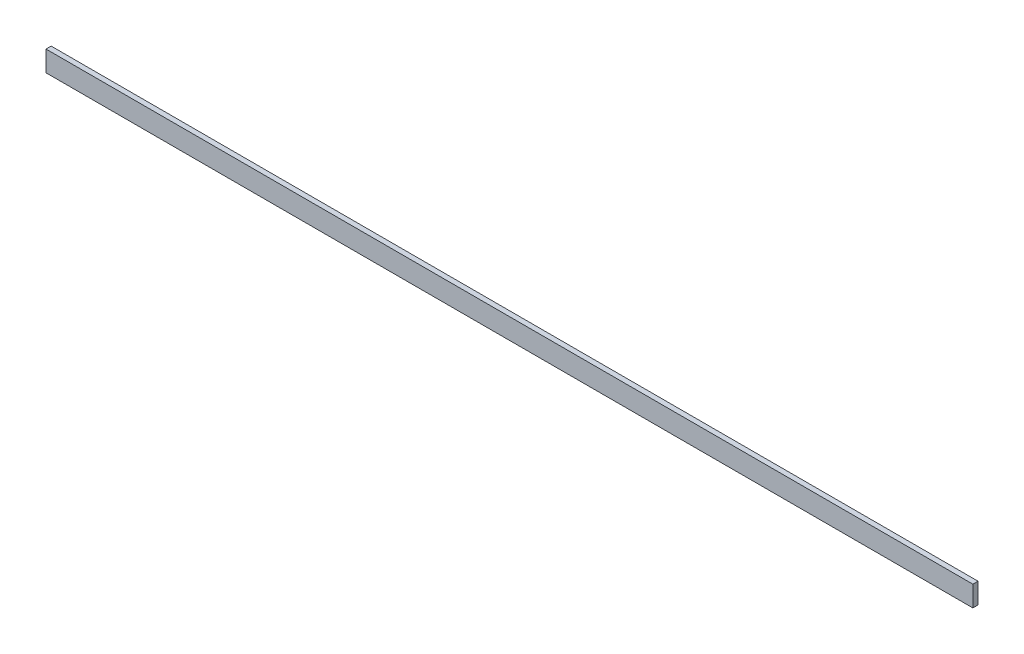
ISO-10303-21;
HEADER;
FILE_DESCRIPTION(('STEP AP214'),'2;1');
FILE_NAME('part.step','',(''),(''),'','','');
FILE_SCHEMA(('AUTOMOTIVE_DESIGN { 1 0 10303 214 1 1 1 1 }'));
ENDSEC;
DATA;
#1=APPLICATION_CONTEXT('core data for automotive mechanical design processes');
#2=APPLICATION_PROTOCOL_DEFINITION('international standard','automotive_design',2000,#1);
#3=PRODUCT_CONTEXT('',#1,'mechanical');
#4=PRODUCT('Part','Part','',(#3));
#5=PRODUCT_RELATED_PRODUCT_CATEGORY('part','',(#4));
#6=PRODUCT_DEFINITION_FORMATION('','',#4);
#7=PRODUCT_DEFINITION_CONTEXT('part definition',#1,'design');
#8=PRODUCT_DEFINITION('design','',#6,#7);
#9=PRODUCT_DEFINITION_SHAPE('','',#8);
#10=(LENGTH_UNIT() NAMED_UNIT(*) SI_UNIT(.MILLI.,.METRE.));
#11=(NAMED_UNIT(*) PLANE_ANGLE_UNIT() SI_UNIT($,.RADIAN.));
#12=(NAMED_UNIT(*) SI_UNIT($,.STERADIAN.) SOLID_ANGLE_UNIT());
#13=UNCERTAINTY_MEASURE_WITH_UNIT(LENGTH_MEASURE(1.E-05),#10,'distance_accuracy_value','');
#14=(GEOMETRIC_REPRESENTATION_CONTEXT(3) GLOBAL_UNCERTAINTY_ASSIGNED_CONTEXT((#13)) GLOBAL_UNIT_ASSIGNED_CONTEXT((#10,
#11,#12)) REPRESENTATION_CONTEXT('',''));
#15=CARTESIAN_POINT('',(0.,0.,0.));
#16=DIRECTION('',(0.,0.,1.));
#17=DIRECTION('',(1.,0.,0.));
#18=AXIS2_PLACEMENT_3D('',#15,#16,#17);
#19=CARTESIAN_POINT('',(28.575,4.7625,-1.27));
#20=DIRECTION('',(0.,0.,-1.));
#21=DIRECTION('',(-1.,0.,0.));
#22=AXIS2_PLACEMENT_3D('',#19,#20,#21);
#23=PLANE('',#22);
#24=CARTESIAN_POINT('',(28.575,4.7625,-1.27));
#25=DIRECTION('',(0.,0.,-1.));
#26=DIRECTION('',(-1.,0.,0.));
#27=AXIS2_PLACEMENT_3D('',#24,#25,#26);
#28=CIRCLE('',#27,3.17499999999997);
#29=CARTESIAN_POINT('',(25.4,4.7625,-1.27));
#30=VERTEX_POINT('',#29);
#31=EDGE_CURVE('E11',#30,#30,#28,.T.);
#32=ORIENTED_EDGE('',*,*,#31,.T.);
#33=EDGE_LOOP('',(#32));
#34=FACE_BOUND('',#33,.T.);
#35=ADVANCED_FACE('F39',(#34),#23,.T.);
#36=CARTESIAN_POINT('',(28.575,4.7625,-1.27));
#37=DIRECTION('',(0.,0.,1.));
#38=DIRECTION('',(1.,0.,0.));
#39=AXIS2_PLACEMENT_3D('',#36,#37,#38);
#40=CYLINDRICAL_SURFACE('',#39,3.17499999999997);
#41=ORIENTED_EDGE('',*,*,#31,.F.);
#42=EDGE_LOOP('',(#41));
#43=FACE_BOUND('',#42,.T.);
#44=CARTESIAN_POINT('',(28.575,4.7625,0.));
#45=DIRECTION('',(0.,0.,-1.));
#46=DIRECTION('',(-1.,0.,0.));
#47=AXIS2_PLACEMENT_3D('',#44,#45,#46);
#48=CIRCLE('',#47,3.17499999999997);
#49=CARTESIAN_POINT('',(25.4,4.7625,0.));
#50=VERTEX_POINT('',#49);
#51=EDGE_CURVE('E48',#50,#50,#48,.T.);
#52=ORIENTED_EDGE('',*,*,#51,.T.);
#53=EDGE_LOOP('',(#52));
#54=FACE_BOUND('',#53,.T.);
#55=ADVANCED_FACE('F291',(#43,#54),#40,.T.);
#56=CARTESIAN_POINT('',(47.625,4.7625,-1.27));
#57=DIRECTION('',(0.,0.,-1.));
#58=DIRECTION('',(-1.,0.,0.));
#59=AXIS2_PLACEMENT_3D('',#56,#57,#58);
#60=PLANE('',#59);
#61=CARTESIAN_POINT('',(47.625,4.7625,-1.27));
#62=DIRECTION('',(0.,0.,-1.));
#63=DIRECTION('',(-1.,0.,0.));
#64=AXIS2_PLACEMENT_3D('',#61,#62,#63);
#65=CIRCLE('',#64,3.17499999999997);
#66=CARTESIAN_POINT('',(44.45,4.7625,-1.27));
#67=VERTEX_POINT('',#66);
#68=EDGE_CURVE('E284',#67,#67,#65,.T.);
#69=ORIENTED_EDGE('',*,*,#68,.T.);
#70=EDGE_LOOP('',(#69));
#71=FACE_BOUND('',#70,.T.);
#72=ADVANCED_FACE('F315',(#71),#60,.T.);
#73=CARTESIAN_POINT('',(47.625,4.7625,-1.27));
#74=DIRECTION('',(0.,0.,1.));
#75=DIRECTION('',(1.,0.,0.));
#76=AXIS2_PLACEMENT_3D('',#73,#74,#75);
#77=CYLINDRICAL_SURFACE('',#76,3.17499999999997);
#78=ORIENTED_EDGE('',*,*,#68,.F.);
#79=EDGE_LOOP('',(#78));
#80=FACE_BOUND('',#79,.T.);
#81=CARTESIAN_POINT('',(47.625,4.7625,0.));
#82=DIRECTION('',(0.,0.,-1.));
#83=DIRECTION('',(-1.,0.,0.));
#84=AXIS2_PLACEMENT_3D('',#81,#82,#83);
#85=CIRCLE('',#84,3.17499999999997);
#86=CARTESIAN_POINT('',(44.45,4.7625,0.));
#87=VERTEX_POINT('',#86);
#88=EDGE_CURVE('E280',#87,#87,#85,.T.);
#89=ORIENTED_EDGE('',*,*,#88,.T.);
#90=EDGE_LOOP('',(#89));
#91=FACE_BOUND('',#90,.T.);
#92=ADVANCED_FACE('F321',(#80,#91),#77,.T.);
#93=CARTESIAN_POINT('',(66.675,4.7625,-1.27));
#94=DIRECTION('',(0.,0.,-1.));
#95=DIRECTION('',(-1.,0.,0.));
#96=AXIS2_PLACEMENT_3D('',#93,#94,#95);
#97=PLANE('',#96);
#98=CARTESIAN_POINT('',(66.675,4.7625,-1.27));
#99=DIRECTION('',(0.,0.,-1.));
#100=DIRECTION('',(-1.,0.,0.));
#101=AXIS2_PLACEMENT_3D('',#98,#99,#100);
#102=CIRCLE('',#101,3.17499999999997);
#103=CARTESIAN_POINT('',(63.5,4.7625,-1.27));
#104=VERTEX_POINT('',#103);
#105=EDGE_CURVE('E276',#104,#104,#102,.T.);
#106=ORIENTED_EDGE('',*,*,#105,.T.);
#107=EDGE_LOOP('',(#106));
#108=FACE_BOUND('',#107,.T.);
#109=ADVANCED_FACE('F327',(#108),#97,.T.);
#110=CARTESIAN_POINT('',(66.675,4.7625,-1.27));
#111=DIRECTION('',(0.,0.,1.));
#112=DIRECTION('',(1.,0.,0.));
#113=AXIS2_PLACEMENT_3D('',#110,#111,#112);
#114=CYLINDRICAL_SURFACE('',#113,3.17499999999997);
#115=ORIENTED_EDGE('',*,*,#105,.F.);
#116=EDGE_LOOP('',(#115));
#117=FACE_BOUND('',#116,.T.);
#118=CARTESIAN_POINT('',(66.675,4.7625,0.));
#119=DIRECTION('',(0.,0.,-1.));
#120=DIRECTION('',(-1.,0.,0.));
#121=AXIS2_PLACEMENT_3D('',#118,#119,#120);
#122=CIRCLE('',#121,3.17499999999997);
#123=CARTESIAN_POINT('',(63.5,4.7625,0.));
#124=VERTEX_POINT('',#123);
#125=EDGE_CURVE('E272',#124,#124,#122,.T.);
#126=ORIENTED_EDGE('',*,*,#125,.T.);
#127=EDGE_LOOP('',(#126));
#128=FACE_BOUND('',#127,.T.);
#129=ADVANCED_FACE('F331',(#117,#128),#114,.T.);
#130=CARTESIAN_POINT('',(85.725,4.7625,-1.27));
#131=DIRECTION('',(0.,0.,-1.));
#132=DIRECTION('',(-1.,0.,0.));
#133=AXIS2_PLACEMENT_3D('',#130,#131,#132);
#134=PLANE('',#133);
#135=CARTESIAN_POINT('',(85.725,4.7625,-1.27));
#136=DIRECTION('',(0.,0.,-1.));
#137=DIRECTION('',(-1.,0.,0.));
#138=AXIS2_PLACEMENT_3D('',#135,#136,#137);
#139=CIRCLE('',#138,3.17499999999997);
#140=CARTESIAN_POINT('',(82.55,4.7625,-1.27));
#141=VERTEX_POINT('',#140);
#142=EDGE_CURVE('E268',#141,#141,#139,.T.);
#143=ORIENTED_EDGE('',*,*,#142,.T.);
#144=EDGE_LOOP('',(#143));
#145=FACE_BOUND('',#144,.T.);
#146=ADVANCED_FACE('F335',(#145),#134,.T.);
#147=CARTESIAN_POINT('',(85.725,4.7625,-1.27));
#148=DIRECTION('',(0.,0.,1.));
#149=DIRECTION('',(1.,0.,0.));
#150=AXIS2_PLACEMENT_3D('',#147,#148,#149);
#151=CYLINDRICAL_SURFACE('',#150,3.17499999999997);
#152=ORIENTED_EDGE('',*,*,#142,.F.);
#153=EDGE_LOOP('',(#152));
#154=FACE_BOUND('',#153,.T.);
#155=CARTESIAN_POINT('',(85.725,4.7625,0.));
#156=DIRECTION('',(0.,0.,-1.));
#157=DIRECTION('',(-1.,0.,0.));
#158=AXIS2_PLACEMENT_3D('',#155,#156,#157);
#159=CIRCLE('',#158,3.17499999999997);
#160=CARTESIAN_POINT('',(82.55,4.7625,0.));
#161=VERTEX_POINT('',#160);
#162=EDGE_CURVE('E264',#161,#161,#159,.T.);
#163=ORIENTED_EDGE('',*,*,#162,.T.);
#164=EDGE_LOOP('',(#163));
#165=FACE_BOUND('',#164,.T.);
#166=ADVANCED_FACE('F339',(#154,#165),#151,.T.);
#167=CARTESIAN_POINT('',(104.775,4.7625,-1.27));
#168=DIRECTION('',(0.,0.,-1.));
#169=DIRECTION('',(-1.,0.,0.));
#170=AXIS2_PLACEMENT_3D('',#167,#168,#169);
#171=PLANE('',#170);
#172=CARTESIAN_POINT('',(104.775,4.7625,-1.27));
#173=DIRECTION('',(0.,0.,-1.));
#174=DIRECTION('',(-1.,0.,0.));
#175=AXIS2_PLACEMENT_3D('',#172,#173,#174);
#176=CIRCLE('',#175,3.17499999999997);
#177=CARTESIAN_POINT('',(101.6,4.7625,-1.27));
#178=VERTEX_POINT('',#177);
#179=EDGE_CURVE('E260',#178,#178,#176,.T.);
#180=ORIENTED_EDGE('',*,*,#179,.T.);
#181=EDGE_LOOP('',(#180));
#182=FACE_BOUND('',#181,.T.);
#183=ADVANCED_FACE('F343',(#182),#171,.T.);
#184=CARTESIAN_POINT('',(104.775,4.7625,-1.27));
#185=DIRECTION('',(0.,0.,1.));
#186=DIRECTION('',(1.,0.,0.));
#187=AXIS2_PLACEMENT_3D('',#184,#185,#186);
#188=CYLINDRICAL_SURFACE('',#187,3.17499999999997);
#189=ORIENTED_EDGE('',*,*,#179,.F.);
#190=EDGE_LOOP('',(#189));
#191=FACE_BOUND('',#190,.T.);
#192=CARTESIAN_POINT('',(104.775,4.7625,0.));
#193=DIRECTION('',(0.,0.,-1.));
#194=DIRECTION('',(-1.,0.,0.));
#195=AXIS2_PLACEMENT_3D('',#192,#193,#194);
#196=CIRCLE('',#195,3.17499999999997);
#197=CARTESIAN_POINT('',(101.6,4.7625,0.));
#198=VERTEX_POINT('',#197);
#199=EDGE_CURVE('E256',#198,#198,#196,.T.);
#200=ORIENTED_EDGE('',*,*,#199,.T.);
#201=EDGE_LOOP('',(#200));
#202=FACE_BOUND('',#201,.T.);
#203=ADVANCED_FACE('F347',(#191,#202),#188,.T.);
#204=CARTESIAN_POINT('',(123.825,4.7625,-1.27));
#205=DIRECTION('',(0.,0.,-1.));
#206=DIRECTION('',(-1.,0.,0.));
#207=AXIS2_PLACEMENT_3D('',#204,#205,#206);
#208=PLANE('',#207);
#209=CARTESIAN_POINT('',(123.825,4.7625,-1.27));
#210=DIRECTION('',(0.,0.,-1.));
#211=DIRECTION('',(-1.,0.,0.));
#212=AXIS2_PLACEMENT_3D('',#209,#210,#211);
#213=CIRCLE('',#212,3.17499999999997);
#214=CARTESIAN_POINT('',(120.65,4.7625,-1.27));
#215=VERTEX_POINT('',#214);
#216=EDGE_CURVE('E252',#215,#215,#213,.T.);
#217=ORIENTED_EDGE('',*,*,#216,.T.);
#218=EDGE_LOOP('',(#217));
#219=FACE_BOUND('',#218,.T.);
#220=ADVANCED_FACE('F351',(#219),#208,.T.);
#221=CARTESIAN_POINT('',(123.825,4.7625,-1.27));
#222=DIRECTION('',(0.,0.,1.));
#223=DIRECTION('',(1.,0.,0.));
#224=AXIS2_PLACEMENT_3D('',#221,#222,#223);
#225=CYLINDRICAL_SURFACE('',#224,3.17499999999997);
#226=ORIENTED_EDGE('',*,*,#216,.F.);
#227=EDGE_LOOP('',(#226));
#228=FACE_BOUND('',#227,.T.);
#229=CARTESIAN_POINT('',(123.825,4.7625,0.));
#230=DIRECTION('',(0.,0.,-1.));
#231=DIRECTION('',(-1.,0.,0.));
#232=AXIS2_PLACEMENT_3D('',#229,#230,#231);
#233=CIRCLE('',#232,3.17499999999997);
#234=CARTESIAN_POINT('',(120.65,4.7625,0.));
#235=VERTEX_POINT('',#234);
#236=EDGE_CURVE('E248',#235,#235,#233,.T.);
#237=ORIENTED_EDGE('',*,*,#236,.T.);
#238=EDGE_LOOP('',(#237));
#239=FACE_BOUND('',#238,.T.);
#240=ADVANCED_FACE('F355',(#228,#239),#225,.T.);
#241=CARTESIAN_POINT('',(142.875,4.7625,-1.27));
#242=DIRECTION('',(0.,0.,-1.));
#243=DIRECTION('',(-1.,0.,0.));
#244=AXIS2_PLACEMENT_3D('',#241,#242,#243);
#245=PLANE('',#244);
#246=CARTESIAN_POINT('',(142.875,4.7625,-1.27));
#247=DIRECTION('',(0.,0.,-1.));
#248=DIRECTION('',(-1.,0.,0.));
#249=AXIS2_PLACEMENT_3D('',#246,#247,#248);
#250=CIRCLE('',#249,3.17499999999997);
#251=CARTESIAN_POINT('',(139.7,4.7625,-1.27));
#252=VERTEX_POINT('',#251);
#253=EDGE_CURVE('E244',#252,#252,#250,.T.);
#254=ORIENTED_EDGE('',*,*,#253,.T.);
#255=EDGE_LOOP('',(#254));
#256=FACE_BOUND('',#255,.T.);
#257=ADVANCED_FACE('F359',(#256),#245,.T.);
#258=CARTESIAN_POINT('',(142.875,4.7625,-1.27));
#259=DIRECTION('',(0.,0.,1.));
#260=DIRECTION('',(1.,0.,0.));
#261=AXIS2_PLACEMENT_3D('',#258,#259,#260);
#262=CYLINDRICAL_SURFACE('',#261,3.17499999999997);
#263=ORIENTED_EDGE('',*,*,#253,.F.);
#264=EDGE_LOOP('',(#263));
#265=FACE_BOUND('',#264,.T.);
#266=CARTESIAN_POINT('',(142.875,4.7625,0.));
#267=DIRECTION('',(0.,0.,-1.));
#268=DIRECTION('',(-1.,0.,0.));
#269=AXIS2_PLACEMENT_3D('',#266,#267,#268);
#270=CIRCLE('',#269,3.17499999999997);
#271=CARTESIAN_POINT('',(139.7,4.7625,0.));
#272=VERTEX_POINT('',#271);
#273=EDGE_CURVE('E240',#272,#272,#270,.T.);
#274=ORIENTED_EDGE('',*,*,#273,.T.);
#275=EDGE_LOOP('',(#274));
#276=FACE_BOUND('',#275,.T.);
#277=ADVANCED_FACE('F363',(#265,#276),#262,.T.);
#278=CARTESIAN_POINT('',(161.925,4.7625,-1.27));
#279=DIRECTION('',(0.,0.,-1.));
#280=DIRECTION('',(-1.,0.,0.));
#281=AXIS2_PLACEMENT_3D('',#278,#279,#280);
#282=PLANE('',#281);
#283=CARTESIAN_POINT('',(161.925,4.7625,-1.27));
#284=DIRECTION('',(0.,0.,-1.));
#285=DIRECTION('',(-1.,0.,0.));
#286=AXIS2_PLACEMENT_3D('',#283,#284,#285);
#287=CIRCLE('',#286,3.17499999999997);
#288=CARTESIAN_POINT('',(158.75,4.7625,-1.27));
#289=VERTEX_POINT('',#288);
#290=EDGE_CURVE('E236',#289,#289,#287,.T.);
#291=ORIENTED_EDGE('',*,*,#290,.T.);
#292=EDGE_LOOP('',(#291));
#293=FACE_BOUND('',#292,.T.);
#294=ADVANCED_FACE('F367',(#293),#282,.T.);
#295=CARTESIAN_POINT('',(161.925,4.7625,-1.27));
#296=DIRECTION('',(0.,0.,1.));
#297=DIRECTION('',(1.,0.,0.));
#298=AXIS2_PLACEMENT_3D('',#295,#296,#297);
#299=CYLINDRICAL_SURFACE('',#298,3.17499999999997);
#300=ORIENTED_EDGE('',*,*,#290,.F.);
#301=EDGE_LOOP('',(#300));
#302=FACE_BOUND('',#301,.T.);
#303=CARTESIAN_POINT('',(161.925,4.7625,0.));
#304=DIRECTION('',(0.,0.,-1.));
#305=DIRECTION('',(-1.,0.,0.));
#306=AXIS2_PLACEMENT_3D('',#303,#304,#305);
#307=CIRCLE('',#306,3.17499999999997);
#308=CARTESIAN_POINT('',(158.75,4.7625,0.));
#309=VERTEX_POINT('',#308);
#310=EDGE_CURVE('E232',#309,#309,#307,.T.);
#311=ORIENTED_EDGE('',*,*,#310,.T.);
#312=EDGE_LOOP('',(#311));
#313=FACE_BOUND('',#312,.T.);
#314=ADVANCED_FACE('F371',(#302,#313),#299,.T.);
#315=CARTESIAN_POINT('',(180.975,4.7625,-1.27));
#316=DIRECTION('',(0.,0.,-1.));
#317=DIRECTION('',(-1.,0.,0.));
#318=AXIS2_PLACEMENT_3D('',#315,#316,#317);
#319=PLANE('',#318);
#320=CARTESIAN_POINT('',(180.975,4.7625,-1.27));
#321=DIRECTION('',(0.,0.,-1.));
#322=DIRECTION('',(-1.,0.,0.));
#323=AXIS2_PLACEMENT_3D('',#320,#321,#322);
#324=CIRCLE('',#323,3.17499999999997);
#325=CARTESIAN_POINT('',(177.8,4.7625,-1.27));
#326=VERTEX_POINT('',#325);
#327=EDGE_CURVE('E228',#326,#326,#324,.T.);
#328=ORIENTED_EDGE('',*,*,#327,.T.);
#329=EDGE_LOOP('',(#328));
#330=FACE_BOUND('',#329,.T.);
#331=ADVANCED_FACE('F375',(#330),#319,.T.);
#332=CARTESIAN_POINT('',(180.975,4.7625,-1.27));
#333=DIRECTION('',(0.,0.,1.));
#334=DIRECTION('',(1.,0.,0.));
#335=AXIS2_PLACEMENT_3D('',#332,#333,#334);
#336=CYLINDRICAL_SURFACE('',#335,3.17499999999997);
#337=ORIENTED_EDGE('',*,*,#327,.F.);
#338=EDGE_LOOP('',(#337));
#339=FACE_BOUND('',#338,.T.);
#340=CARTESIAN_POINT('',(180.975,4.7625,0.));
#341=DIRECTION('',(0.,0.,-1.));
#342=DIRECTION('',(-1.,0.,0.));
#343=AXIS2_PLACEMENT_3D('',#340,#341,#342);
#344=CIRCLE('',#343,3.17499999999997);
#345=CARTESIAN_POINT('',(177.8,4.7625,0.));
#346=VERTEX_POINT('',#345);
#347=EDGE_CURVE('E224',#346,#346,#344,.T.);
#348=ORIENTED_EDGE('',*,*,#347,.T.);
#349=EDGE_LOOP('',(#348));
#350=FACE_BOUND('',#349,.T.);
#351=ADVANCED_FACE('F379',(#339,#350),#336,.T.);
#352=CARTESIAN_POINT('',(200.025,4.7625,-1.27));
#353=DIRECTION('',(0.,0.,-1.));
#354=DIRECTION('',(-1.,0.,0.));
#355=AXIS2_PLACEMENT_3D('',#352,#353,#354);
#356=PLANE('',#355);
#357=CARTESIAN_POINT('',(200.025,4.7625,-1.27));
#358=DIRECTION('',(0.,0.,-1.));
#359=DIRECTION('',(-1.,0.,0.));
#360=AXIS2_PLACEMENT_3D('',#357,#358,#359);
#361=CIRCLE('',#360,3.17499999999997);
#362=CARTESIAN_POINT('',(196.85,4.7625,-1.27));
#363=VERTEX_POINT('',#362);
#364=EDGE_CURVE('E220',#363,#363,#361,.T.);
#365=ORIENTED_EDGE('',*,*,#364,.T.);
#366=EDGE_LOOP('',(#365));
#367=FACE_BOUND('',#366,.T.);
#368=ADVANCED_FACE('F383',(#367),#356,.T.);
#369=CARTESIAN_POINT('',(200.025,4.7625,-1.27));
#370=DIRECTION('',(0.,0.,1.));
#371=DIRECTION('',(1.,0.,0.));
#372=AXIS2_PLACEMENT_3D('',#369,#370,#371);
#373=CYLINDRICAL_SURFACE('',#372,3.17499999999997);
#374=ORIENTED_EDGE('',*,*,#364,.F.);
#375=EDGE_LOOP('',(#374));
#376=FACE_BOUND('',#375,.T.);
#377=CARTESIAN_POINT('',(200.025,4.7625,0.));
#378=DIRECTION('',(0.,0.,-1.));
#379=DIRECTION('',(-1.,0.,0.));
#380=AXIS2_PLACEMENT_3D('',#377,#378,#379);
#381=CIRCLE('',#380,3.17499999999997);
#382=CARTESIAN_POINT('',(196.85,4.7625,0.));
#383=VERTEX_POINT('',#382);
#384=EDGE_CURVE('E216',#383,#383,#381,.T.);
#385=ORIENTED_EDGE('',*,*,#384,.T.);
#386=EDGE_LOOP('',(#385));
#387=FACE_BOUND('',#386,.T.);
#388=ADVANCED_FACE('F387',(#376,#387),#373,.T.);
#389=CARTESIAN_POINT('',(219.075,4.7625,-1.27));
#390=DIRECTION('',(0.,0.,-1.));
#391=DIRECTION('',(-1.,0.,0.));
#392=AXIS2_PLACEMENT_3D('',#389,#390,#391);
#393=PLANE('',#392);
#394=CARTESIAN_POINT('',(219.075,4.7625,-1.27));
#395=DIRECTION('',(0.,0.,-1.));
#396=DIRECTION('',(-1.,0.,0.));
#397=AXIS2_PLACEMENT_3D('',#394,#395,#396);
#398=CIRCLE('',#397,3.17499999999997);
#399=CARTESIAN_POINT('',(215.9,4.7625,-1.27));
#400=VERTEX_POINT('',#399);
#401=EDGE_CURVE('E212',#400,#400,#398,.T.);
#402=ORIENTED_EDGE('',*,*,#401,.T.);
#403=EDGE_LOOP('',(#402));
#404=FACE_BOUND('',#403,.T.);
#405=ADVANCED_FACE('F391',(#404),#393,.T.);
#406=CARTESIAN_POINT('',(219.075,4.7625,-1.27));
#407=DIRECTION('',(0.,0.,1.));
#408=DIRECTION('',(1.,0.,0.));
#409=AXIS2_PLACEMENT_3D('',#406,#407,#408);
#410=CYLINDRICAL_SURFACE('',#409,3.17499999999997);
#411=ORIENTED_EDGE('',*,*,#401,.F.);
#412=EDGE_LOOP('',(#411));
#413=FACE_BOUND('',#412,.T.);
#414=CARTESIAN_POINT('',(219.075,4.7625,0.));
#415=DIRECTION('',(0.,0.,-1.));
#416=DIRECTION('',(-1.,0.,0.));
#417=AXIS2_PLACEMENT_3D('',#414,#415,#416);
#418=CIRCLE('',#417,3.17499999999997);
#419=CARTESIAN_POINT('',(215.9,4.7625,0.));
#420=VERTEX_POINT('',#419);
#421=EDGE_CURVE('E208',#420,#420,#418,.T.);
#422=ORIENTED_EDGE('',*,*,#421,.T.);
#423=EDGE_LOOP('',(#422));
#424=FACE_BOUND('',#423,.T.);
#425=ADVANCED_FACE('F395',(#413,#424),#410,.T.);
#426=CARTESIAN_POINT('',(238.125,4.7625,-1.27));
#427=DIRECTION('',(0.,0.,-1.));
#428=DIRECTION('',(-1.,0.,0.));
#429=AXIS2_PLACEMENT_3D('',#426,#427,#428);
#430=PLANE('',#429);
#431=CARTESIAN_POINT('',(238.125,4.7625,-1.27));
#432=DIRECTION('',(0.,0.,-1.));
#433=DIRECTION('',(-1.,0.,0.));
#434=AXIS2_PLACEMENT_3D('',#431,#432,#433);
#435=CIRCLE('',#434,3.17499999999997);
#436=CARTESIAN_POINT('',(234.95,4.7625,-1.27));
#437=VERTEX_POINT('',#436);
#438=EDGE_CURVE('E204',#437,#437,#435,.T.);
#439=ORIENTED_EDGE('',*,*,#438,.T.);
#440=EDGE_LOOP('',(#439));
#441=FACE_BOUND('',#440,.T.);
#442=ADVANCED_FACE('F399',(#441),#430,.T.);
#443=CARTESIAN_POINT('',(238.125,4.7625,-1.27));
#444=DIRECTION('',(0.,0.,1.));
#445=DIRECTION('',(1.,0.,0.));
#446=AXIS2_PLACEMENT_3D('',#443,#444,#445);
#447=CYLINDRICAL_SURFACE('',#446,3.17499999999997);
#448=ORIENTED_EDGE('',*,*,#438,.F.);
#449=EDGE_LOOP('',(#448));
#450=FACE_BOUND('',#449,.T.);
#451=CARTESIAN_POINT('',(238.125,4.7625,0.));
#452=DIRECTION('',(0.,0.,-1.));
#453=DIRECTION('',(-1.,0.,0.));
#454=AXIS2_PLACEMENT_3D('',#451,#452,#453);
#455=CIRCLE('',#454,3.17499999999997);
#456=CARTESIAN_POINT('',(234.95,4.7625,0.));
#457=VERTEX_POINT('',#456);
#458=EDGE_CURVE('E200',#457,#457,#455,.T.);
#459=ORIENTED_EDGE('',*,*,#458,.T.);
#460=EDGE_LOOP('',(#459));
#461=FACE_BOUND('',#460,.T.);
#462=ADVANCED_FACE('F403',(#450,#461),#447,.T.);
#463=CARTESIAN_POINT('',(257.175,4.7625,-1.27));
#464=DIRECTION('',(0.,0.,-1.));
#465=DIRECTION('',(-1.,0.,0.));
#466=AXIS2_PLACEMENT_3D('',#463,#464,#465);
#467=PLANE('',#466);
#468=CARTESIAN_POINT('',(257.175,4.7625,-1.27));
#469=DIRECTION('',(0.,0.,-1.));
#470=DIRECTION('',(-1.,0.,0.));
#471=AXIS2_PLACEMENT_3D('',#468,#469,#470);
#472=CIRCLE('',#471,3.17499999999997);
#473=CARTESIAN_POINT('',(254.,4.7625,-1.27));
#474=VERTEX_POINT('',#473);
#475=EDGE_CURVE('E196',#474,#474,#472,.T.);
#476=ORIENTED_EDGE('',*,*,#475,.T.);
#477=EDGE_LOOP('',(#476));
#478=FACE_BOUND('',#477,.T.);
#479=ADVANCED_FACE('F407',(#478),#467,.T.);
#480=CARTESIAN_POINT('',(257.175,4.7625,-1.27));
#481=DIRECTION('',(0.,0.,1.));
#482=DIRECTION('',(1.,0.,0.));
#483=AXIS2_PLACEMENT_3D('',#480,#481,#482);
#484=CYLINDRICAL_SURFACE('',#483,3.17499999999997);
#485=ORIENTED_EDGE('',*,*,#475,.F.);
#486=EDGE_LOOP('',(#485));
#487=FACE_BOUND('',#486,.T.);
#488=CARTESIAN_POINT('',(257.175,4.7625,0.));
#489=DIRECTION('',(0.,0.,-1.));
#490=DIRECTION('',(-1.,0.,0.));
#491=AXIS2_PLACEMENT_3D('',#488,#489,#490);
#492=CIRCLE('',#491,3.17499999999997);
#493=CARTESIAN_POINT('',(254.,4.7625,0.));
#494=VERTEX_POINT('',#493);
#495=EDGE_CURVE('E192',#494,#494,#492,.T.);
#496=ORIENTED_EDGE('',*,*,#495,.T.);
#497=EDGE_LOOP('',(#496));
#498=FACE_BOUND('',#497,.T.);
#499=ADVANCED_FACE('F411',(#487,#498),#484,.T.);
#500=CARTESIAN_POINT('',(276.225,4.7625,-1.27));
#501=DIRECTION('',(0.,0.,-1.));
#502=DIRECTION('',(-1.,0.,0.));
#503=AXIS2_PLACEMENT_3D('',#500,#501,#502);
#504=PLANE('',#503);
#505=CARTESIAN_POINT('',(276.225,4.7625,-1.27));
#506=DIRECTION('',(0.,0.,-1.));
#507=DIRECTION('',(-1.,0.,0.));
#508=AXIS2_PLACEMENT_3D('',#505,#506,#507);
#509=CIRCLE('',#508,3.17499999999997);
#510=CARTESIAN_POINT('',(273.05,4.7625,-1.27));
#511=VERTEX_POINT('',#510);
#512=EDGE_CURVE('E188',#511,#511,#509,.T.);
#513=ORIENTED_EDGE('',*,*,#512,.T.);
#514=EDGE_LOOP('',(#513));
#515=FACE_BOUND('',#514,.T.);
#516=ADVANCED_FACE('F415',(#515),#504,.T.);
#517=CARTESIAN_POINT('',(276.225,4.7625,-1.27));
#518=DIRECTION('',(0.,0.,1.));
#519=DIRECTION('',(1.,0.,0.));
#520=AXIS2_PLACEMENT_3D('',#517,#518,#519);
#521=CYLINDRICAL_SURFACE('',#520,3.17499999999997);
#522=ORIENTED_EDGE('',*,*,#512,.F.);
#523=EDGE_LOOP('',(#522));
#524=FACE_BOUND('',#523,.T.);
#525=CARTESIAN_POINT('',(276.225,4.7625,0.));
#526=DIRECTION('',(0.,0.,-1.));
#527=DIRECTION('',(-1.,0.,0.));
#528=AXIS2_PLACEMENT_3D('',#525,#526,#527);
#529=CIRCLE('',#528,3.17499999999997);
#530=CARTESIAN_POINT('',(273.05,4.7625,0.));
#531=VERTEX_POINT('',#530);
#532=EDGE_CURVE('E184',#531,#531,#529,.T.);
#533=ORIENTED_EDGE('',*,*,#532,.T.);
#534=EDGE_LOOP('',(#533));
#535=FACE_BOUND('',#534,.T.);
#536=ADVANCED_FACE('F419',(#524,#535),#521,.T.);
#537=CARTESIAN_POINT('',(295.275,4.7625,-1.27));
#538=DIRECTION('',(0.,0.,-1.));
#539=DIRECTION('',(-1.,0.,0.));
#540=AXIS2_PLACEMENT_3D('',#537,#538,#539);
#541=PLANE('',#540);
#542=CARTESIAN_POINT('',(295.275,4.7625,-1.27));
#543=DIRECTION('',(0.,0.,-1.));
#544=DIRECTION('',(-1.,0.,0.));
#545=AXIS2_PLACEMENT_3D('',#542,#543,#544);
#546=CIRCLE('',#545,3.17499999999997);
#547=CARTESIAN_POINT('',(292.1,4.7625,-1.27));
#548=VERTEX_POINT('',#547);
#549=EDGE_CURVE('E180',#548,#548,#546,.T.);
#550=ORIENTED_EDGE('',*,*,#549,.T.);
#551=EDGE_LOOP('',(#550));
#552=FACE_BOUND('',#551,.T.);
#553=ADVANCED_FACE('F423',(#552),#541,.T.);
#554=CARTESIAN_POINT('',(295.275,4.7625,-1.27));
#555=DIRECTION('',(0.,0.,1.));
#556=DIRECTION('',(1.,0.,0.));
#557=AXIS2_PLACEMENT_3D('',#554,#555,#556);
#558=CYLINDRICAL_SURFACE('',#557,3.17499999999997);
#559=ORIENTED_EDGE('',*,*,#549,.F.);
#560=EDGE_LOOP('',(#559));
#561=FACE_BOUND('',#560,.T.);
#562=CARTESIAN_POINT('',(295.275,4.7625,0.));
#563=DIRECTION('',(0.,0.,-1.));
#564=DIRECTION('',(-1.,0.,0.));
#565=AXIS2_PLACEMENT_3D('',#562,#563,#564);
#566=CIRCLE('',#565,3.17499999999997);
#567=CARTESIAN_POINT('',(292.1,4.7625,0.));
#568=VERTEX_POINT('',#567);
#569=EDGE_CURVE('E176',#568,#568,#566,.T.);
#570=ORIENTED_EDGE('',*,*,#569,.T.);
#571=EDGE_LOOP('',(#570));
#572=FACE_BOUND('',#571,.T.);
#573=ADVANCED_FACE('F427',(#561,#572),#558,.T.);
#574=CARTESIAN_POINT('',(314.325,4.7625,-1.27));
#575=DIRECTION('',(0.,0.,-1.));
#576=DIRECTION('',(-1.,0.,0.));
#577=AXIS2_PLACEMENT_3D('',#574,#575,#576);
#578=PLANE('',#577);
#579=CARTESIAN_POINT('',(314.325,4.7625,-1.27));
#580=DIRECTION('',(0.,0.,-1.));
#581=DIRECTION('',(-1.,0.,0.));
#582=AXIS2_PLACEMENT_3D('',#579,#580,#581);
#583=CIRCLE('',#582,3.17499999999997);
#584=CARTESIAN_POINT('',(311.15,4.7625,-1.27));
#585=VERTEX_POINT('',#584);
#586=EDGE_CURVE('E172',#585,#585,#583,.T.);
#587=ORIENTED_EDGE('',*,*,#586,.T.);
#588=EDGE_LOOP('',(#587));
#589=FACE_BOUND('',#588,.T.);
#590=ADVANCED_FACE('F431',(#589),#578,.T.);
#591=CARTESIAN_POINT('',(314.325,4.7625,-1.27));
#592=DIRECTION('',(0.,0.,1.));
#593=DIRECTION('',(1.,0.,0.));
#594=AXIS2_PLACEMENT_3D('',#591,#592,#593);
#595=CYLINDRICAL_SURFACE('',#594,3.17499999999997);
#596=ORIENTED_EDGE('',*,*,#586,.F.);
#597=EDGE_LOOP('',(#596));
#598=FACE_BOUND('',#597,.T.);
#599=CARTESIAN_POINT('',(314.325,4.7625,0.));
#600=DIRECTION('',(0.,0.,-1.));
#601=DIRECTION('',(-1.,0.,0.));
#602=AXIS2_PLACEMENT_3D('',#599,#600,#601);
#603=CIRCLE('',#602,3.17499999999997);
#604=CARTESIAN_POINT('',(311.15,4.7625,0.));
#605=VERTEX_POINT('',#604);
#606=EDGE_CURVE('E168',#605,#605,#603,.T.);
#607=ORIENTED_EDGE('',*,*,#606,.T.);
#608=EDGE_LOOP('',(#607));
#609=FACE_BOUND('',#608,.T.);
#610=ADVANCED_FACE('F435',(#598,#609),#595,.T.);
#611=CARTESIAN_POINT('',(333.375,4.7625,-1.27));
#612=DIRECTION('',(0.,0.,-1.));
#613=DIRECTION('',(-1.,0.,0.));
#614=AXIS2_PLACEMENT_3D('',#611,#612,#613);
#615=PLANE('',#614);
#616=CARTESIAN_POINT('',(333.375,4.7625,-1.27));
#617=DIRECTION('',(0.,0.,-1.));
#618=DIRECTION('',(-1.,0.,0.));
#619=AXIS2_PLACEMENT_3D('',#616,#617,#618);
#620=CIRCLE('',#619,3.17499999999997);
#621=CARTESIAN_POINT('',(330.2,4.7625,-1.27));
#622=VERTEX_POINT('',#621);
#623=EDGE_CURVE('E164',#622,#622,#620,.T.);
#624=ORIENTED_EDGE('',*,*,#623,.T.);
#625=EDGE_LOOP('',(#624));
#626=FACE_BOUND('',#625,.T.);
#627=ADVANCED_FACE('F439',(#626),#615,.T.);
#628=CARTESIAN_POINT('',(333.375,4.7625,-1.27));
#629=DIRECTION('',(0.,0.,1.));
#630=DIRECTION('',(1.,0.,0.));
#631=AXIS2_PLACEMENT_3D('',#628,#629,#630);
#632=CYLINDRICAL_SURFACE('',#631,3.17499999999997);
#633=ORIENTED_EDGE('',*,*,#623,.F.);
#634=EDGE_LOOP('',(#633));
#635=FACE_BOUND('',#634,.T.);
#636=CARTESIAN_POINT('',(333.375,4.7625,0.));
#637=DIRECTION('',(0.,0.,-1.));
#638=DIRECTION('',(-1.,0.,0.));
#639=AXIS2_PLACEMENT_3D('',#636,#637,#638);
#640=CIRCLE('',#639,3.17499999999997);
#641=CARTESIAN_POINT('',(330.2,4.7625,0.));
#642=VERTEX_POINT('',#641);
#643=EDGE_CURVE('E160',#642,#642,#640,.T.);
#644=ORIENTED_EDGE('',*,*,#643,.T.);
#645=EDGE_LOOP('',(#644));
#646=FACE_BOUND('',#645,.T.);
#647=ADVANCED_FACE('F443',(#635,#646),#632,.T.);
#648=CARTESIAN_POINT('',(352.425,4.7625,-1.27));
#649=DIRECTION('',(0.,0.,-1.));
#650=DIRECTION('',(-1.,0.,0.));
#651=AXIS2_PLACEMENT_3D('',#648,#649,#650);
#652=PLANE('',#651);
#653=CARTESIAN_POINT('',(352.425,4.7625,-1.27));
#654=DIRECTION('',(0.,0.,-1.));
#655=DIRECTION('',(-1.,0.,0.));
#656=AXIS2_PLACEMENT_3D('',#653,#654,#655);
#657=CIRCLE('',#656,3.17499999999997);
#658=CARTESIAN_POINT('',(349.25,4.7625,-1.27));
#659=VERTEX_POINT('',#658);
#660=EDGE_CURVE('E156',#659,#659,#657,.T.);
#661=ORIENTED_EDGE('',*,*,#660,.T.);
#662=EDGE_LOOP('',(#661));
#663=FACE_BOUND('',#662,.T.);
#664=ADVANCED_FACE('F447',(#663),#652,.T.);
#665=CARTESIAN_POINT('',(352.425,4.7625,-1.27));
#666=DIRECTION('',(0.,0.,1.));
#667=DIRECTION('',(1.,0.,0.));
#668=AXIS2_PLACEMENT_3D('',#665,#666,#667);
#669=CYLINDRICAL_SURFACE('',#668,3.17499999999997);
#670=ORIENTED_EDGE('',*,*,#660,.F.);
#671=EDGE_LOOP('',(#670));
#672=FACE_BOUND('',#671,.T.);
#673=CARTESIAN_POINT('',(352.425,4.7625,0.));
#674=DIRECTION('',(0.,0.,-1.));
#675=DIRECTION('',(-1.,0.,0.));
#676=AXIS2_PLACEMENT_3D('',#673,#674,#675);
#677=CIRCLE('',#676,3.17499999999997);
#678=CARTESIAN_POINT('',(349.25,4.7625,0.));
#679=VERTEX_POINT('',#678);
#680=EDGE_CURVE('E152',#679,#679,#677,.T.);
#681=ORIENTED_EDGE('',*,*,#680,.T.);
#682=EDGE_LOOP('',(#681));
#683=FACE_BOUND('',#682,.T.);
#684=ADVANCED_FACE('F451',(#672,#683),#669,.T.);
#685=CARTESIAN_POINT('',(371.475,4.7625,-1.27));
#686=DIRECTION('',(0.,0.,-1.));
#687=DIRECTION('',(-1.,0.,0.));
#688=AXIS2_PLACEMENT_3D('',#685,#686,#687);
#689=PLANE('',#688);
#690=CARTESIAN_POINT('',(371.475,4.7625,-1.27));
#691=DIRECTION('',(0.,0.,-1.));
#692=DIRECTION('',(-1.,0.,0.));
#693=AXIS2_PLACEMENT_3D('',#690,#691,#692);
#694=CIRCLE('',#693,3.17499999999997);
#695=CARTESIAN_POINT('',(368.3,4.7625,-1.27));
#696=VERTEX_POINT('',#695);
#697=EDGE_CURVE('E148',#696,#696,#694,.T.);
#698=ORIENTED_EDGE('',*,*,#697,.T.);
#699=EDGE_LOOP('',(#698));
#700=FACE_BOUND('',#699,.T.);
#701=ADVANCED_FACE('F455',(#700),#689,.T.);
#702=CARTESIAN_POINT('',(371.475,4.7625,-1.27));
#703=DIRECTION('',(0.,0.,1.));
#704=DIRECTION('',(1.,0.,0.));
#705=AXIS2_PLACEMENT_3D('',#702,#703,#704);
#706=CYLINDRICAL_SURFACE('',#705,3.17499999999997);
#707=ORIENTED_EDGE('',*,*,#697,.F.);
#708=EDGE_LOOP('',(#707));
#709=FACE_BOUND('',#708,.T.);
#710=CARTESIAN_POINT('',(371.475,4.7625,0.));
#711=DIRECTION('',(0.,0.,-1.));
#712=DIRECTION('',(-1.,0.,0.));
#713=AXIS2_PLACEMENT_3D('',#710,#711,#712);
#714=CIRCLE('',#713,3.17499999999997);
#715=CARTESIAN_POINT('',(368.3,4.7625,0.));
#716=VERTEX_POINT('',#715);
#717=EDGE_CURVE('E144',#716,#716,#714,.T.);
#718=ORIENTED_EDGE('',*,*,#717,.T.);
#719=EDGE_LOOP('',(#718));
#720=FACE_BOUND('',#719,.T.);
#721=ADVANCED_FACE('F459',(#709,#720),#706,.T.);
#722=CARTESIAN_POINT('',(390.525,4.7625,-1.27));
#723=DIRECTION('',(0.,0.,-1.));
#724=DIRECTION('',(-1.,0.,0.));
#725=AXIS2_PLACEMENT_3D('',#722,#723,#724);
#726=PLANE('',#725);
#727=CARTESIAN_POINT('',(390.525,4.7625,-1.27));
#728=DIRECTION('',(0.,0.,-1.));
#729=DIRECTION('',(-1.,0.,0.));
#730=AXIS2_PLACEMENT_3D('',#727,#728,#729);
#731=CIRCLE('',#730,3.17499999999997);
#732=CARTESIAN_POINT('',(387.35,4.7625,-1.27));
#733=VERTEX_POINT('',#732);
#734=EDGE_CURVE('E140',#733,#733,#731,.T.);
#735=ORIENTED_EDGE('',*,*,#734,.T.);
#736=EDGE_LOOP('',(#735));
#737=FACE_BOUND('',#736,.T.);
#738=ADVANCED_FACE('F463',(#737),#726,.T.);
#739=CARTESIAN_POINT('',(390.525,4.7625,-1.27));
#740=DIRECTION('',(0.,0.,1.));
#741=DIRECTION('',(1.,0.,0.));
#742=AXIS2_PLACEMENT_3D('',#739,#740,#741);
#743=CYLINDRICAL_SURFACE('',#742,3.17499999999997);
#744=ORIENTED_EDGE('',*,*,#734,.F.);
#745=EDGE_LOOP('',(#744));
#746=FACE_BOUND('',#745,.T.);
#747=CARTESIAN_POINT('',(390.525,4.7625,0.));
#748=DIRECTION('',(0.,0.,-1.));
#749=DIRECTION('',(-1.,0.,0.));
#750=AXIS2_PLACEMENT_3D('',#747,#748,#749);
#751=CIRCLE('',#750,3.17499999999997);
#752=CARTESIAN_POINT('',(387.35,4.7625,0.));
#753=VERTEX_POINT('',#752);
#754=EDGE_CURVE('E136',#753,#753,#751,.T.);
#755=ORIENTED_EDGE('',*,*,#754,.T.);
#756=EDGE_LOOP('',(#755));
#757=FACE_BOUND('',#756,.T.);
#758=ADVANCED_FACE('F467',(#746,#757),#743,.T.);
#759=CARTESIAN_POINT('',(409.575,4.7625,-1.27));
#760=DIRECTION('',(0.,0.,-1.));
#761=DIRECTION('',(-1.,0.,0.));
#762=AXIS2_PLACEMENT_3D('',#759,#760,#761);
#763=PLANE('',#762);
#764=CARTESIAN_POINT('',(409.575,4.7625,-1.27));
#765=DIRECTION('',(0.,0.,-1.));
#766=DIRECTION('',(-1.,0.,0.));
#767=AXIS2_PLACEMENT_3D('',#764,#765,#766);
#768=CIRCLE('',#767,3.17499999999997);
#769=CARTESIAN_POINT('',(406.4,4.7625,-1.27));
#770=VERTEX_POINT('',#769);
#771=EDGE_CURVE('E132',#770,#770,#768,.T.);
#772=ORIENTED_EDGE('',*,*,#771,.T.);
#773=EDGE_LOOP('',(#772));
#774=FACE_BOUND('',#773,.T.);
#775=ADVANCED_FACE('F471',(#774),#763,.T.);
#776=CARTESIAN_POINT('',(409.575,4.7625,-1.27));
#777=DIRECTION('',(0.,0.,1.));
#778=DIRECTION('',(1.,0.,0.));
#779=AXIS2_PLACEMENT_3D('',#776,#777,#778);
#780=CYLINDRICAL_SURFACE('',#779,3.17499999999997);
#781=ORIENTED_EDGE('',*,*,#771,.F.);
#782=EDGE_LOOP('',(#781));
#783=FACE_BOUND('',#782,.T.);
#784=CARTESIAN_POINT('',(409.575,4.7625,0.));
#785=DIRECTION('',(0.,0.,-1.));
#786=DIRECTION('',(-1.,0.,0.));
#787=AXIS2_PLACEMENT_3D('',#784,#785,#786);
#788=CIRCLE('',#787,3.17499999999997);
#789=CARTESIAN_POINT('',(406.4,4.7625,0.));
#790=VERTEX_POINT('',#789);
#791=EDGE_CURVE('E128',#790,#790,#788,.T.);
#792=ORIENTED_EDGE('',*,*,#791,.T.);
#793=EDGE_LOOP('',(#792));
#794=FACE_BOUND('',#793,.T.);
#795=ADVANCED_FACE('F475',(#783,#794),#780,.T.);
#796=CARTESIAN_POINT('',(0.,0.,2.54));
#797=DIRECTION('',(1.,0.,0.));
#798=DIRECTION('',(0.,0.,-1.));
#799=AXIS2_PLACEMENT_3D('',#796,#797,#798);
#800=PLANE('',#799);
#801=DIRECTION('',(0.,-1.,0.));
#802=VECTOR('',#801,1.);
#803=CARTESIAN_POINT('',(0.,0.,0.));
#804=LINE('',#803,#802);
#805=CARTESIAN_POINT('',(0.,10.16,0.));
#806=VERTEX_POINT('',#805);
#807=CARTESIAN_POINT('',(0.,0.,0.));
#808=VERTEX_POINT('',#807);
#809=EDGE_CURVE('E111',#806,#808,#804,.T.);
#810=ORIENTED_EDGE('',*,*,#809,.T.);
#811=DIRECTION('',(0.,0.,-1.));
#812=VECTOR('',#811,1.);
#813=CARTESIAN_POINT('',(0.,0.,2.54));
#814=LINE('',#813,#812);
#815=CARTESIAN_POINT('',(0.,0.,2.54));
#816=VERTEX_POINT('',#815);
#817=EDGE_CURVE('E100',#816,#808,#814,.T.);
#818=ORIENTED_EDGE('',*,*,#817,.F.);
#819=DIRECTION('',(0.,-1.,0.));
#820=VECTOR('',#819,1.);
#821=CARTESIAN_POINT('',(0.,0.,2.54));
#822=LINE('',#821,#820);
#823=CARTESIAN_POINT('',(0.,10.16,2.54));
#824=VERTEX_POINT('',#823);
#825=EDGE_CURVE('E92',#824,#816,#822,.T.);
#826=ORIENTED_EDGE('',*,*,#825,.F.);
#827=DIRECTION('',(0.,0.,-1.));
#828=VECTOR('',#827,1.);
#829=CARTESIAN_POINT('',(0.,10.16,2.54));
#830=LINE('',#829,#828);
#831=EDGE_CURVE('E107',#824,#806,#830,.T.);
#832=ORIENTED_EDGE('',*,*,#831,.T.);
#833=EDGE_LOOP('',(#810,#818,#826,#832));
#834=FACE_BOUND('',#833,.T.);
#835=ADVANCED_FACE('F479',(#834),#800,.F.);
#836=CARTESIAN_POINT('',(0.,0.,2.54));
#837=DIRECTION('',(0.,1.,0.));
#838=DIRECTION('',(0.,0.,1.));
#839=AXIS2_PLACEMENT_3D('',#836,#837,#838);
#840=PLANE('',#839);
#841=DIRECTION('',(1.,0.,0.));
#842=VECTOR('',#841,1.);
#843=CARTESIAN_POINT('',(0.,0.,0.));
#844=LINE('',#843,#842);
#845=CARTESIAN_POINT('',(457.2,0.,0.));
#846=VERTEX_POINT('',#845);
#847=EDGE_CURVE('E98',#808,#846,#844,.T.);
#848=ORIENTED_EDGE('',*,*,#847,.T.);
#849=DIRECTION('',(0.,0.,-1.));
#850=VECTOR('',#849,1.);
#851=CARTESIAN_POINT('',(457.2,0.,2.54));
#852=LINE('',#851,#850);
#853=CARTESIAN_POINT('',(457.2,0.,2.54));
#854=VERTEX_POINT('',#853);
#855=EDGE_CURVE('E96',#854,#846,#852,.T.);
#856=ORIENTED_EDGE('',*,*,#855,.F.);
#857=DIRECTION('',(1.,0.,0.));
#858=VECTOR('',#857,1.);
#859=CARTESIAN_POINT('',(0.,0.,2.54));
#860=LINE('',#859,#858);
#861=EDGE_CURVE('E87',#816,#854,#860,.T.);
#862=ORIENTED_EDGE('',*,*,#861,.F.);
#863=ORIENTED_EDGE('',*,*,#817,.T.);
#864=EDGE_LOOP('',(#848,#856,#862,#863));
#865=FACE_BOUND('',#864,.T.);
#866=ADVANCED_FACE('F97',(#865),#840,.F.);
#867=CARTESIAN_POINT('',(457.2,0.,2.54));
#868=DIRECTION('',(-1.,0.,0.));
#869=DIRECTION('',(0.,0.,1.));
#870=AXIS2_PLACEMENT_3D('',#867,#868,#869);
#871=PLANE('',#870);
#872=DIRECTION('',(0.,1.,0.));
#873=VECTOR('',#872,1.);
#874=CARTESIAN_POINT('',(457.2,0.,0.));
#875=LINE('',#874,#873);
#876=CARTESIAN_POINT('',(457.2,10.16,0.));
#877=VERTEX_POINT('',#876);
#878=EDGE_CURVE('E73',#846,#877,#875,.T.);
#879=ORIENTED_EDGE('',*,*,#878,.T.);
#880=DIRECTION('',(0.,0.,-1.));
#881=VECTOR('',#880,1.);
#882=CARTESIAN_POINT('',(457.2,10.16,2.54));
#883=LINE('',#882,#881);
#884=CARTESIAN_POINT('',(457.2,10.16,2.54));
#885=VERTEX_POINT('',#884);
#886=EDGE_CURVE('E101',#885,#877,#883,.T.);
#887=ORIENTED_EDGE('',*,*,#886,.F.);
#888=DIRECTION('',(0.,1.,0.));
#889=VECTOR('',#888,1.);
#890=CARTESIAN_POINT('',(457.2,0.,2.54));
#891=LINE('',#890,#889);
#892=EDGE_CURVE('E90',#854,#885,#891,.T.);
#893=ORIENTED_EDGE('',*,*,#892,.F.);
#894=ORIENTED_EDGE('',*,*,#855,.T.);
#895=EDGE_LOOP('',(#879,#887,#893,#894));
#896=FACE_BOUND('',#895,.T.);
#897=ADVANCED_FACE('F103',(#896),#871,.F.);
#898=CARTESIAN_POINT('',(0.,10.16,2.54));
#899=DIRECTION('',(0.,-1.,0.));
#900=DIRECTION('',(0.,0.,-1.));
#901=AXIS2_PLACEMENT_3D('',#898,#899,#900);
#902=PLANE('',#901);
#903=DIRECTION('',(-1.,0.,0.));
#904=VECTOR('',#903,1.);
#905=CARTESIAN_POINT('',(0.,10.16,0.));
#906=LINE('',#905,#904);
#907=EDGE_CURVE('E79',#877,#806,#906,.T.);
#908=ORIENTED_EDGE('',*,*,#907,.T.);
#909=ORIENTED_EDGE('',*,*,#831,.F.);
#910=DIRECTION('',(-1.,0.,0.));
#911=VECTOR('',#910,1.);
#912=CARTESIAN_POINT('',(0.,10.16,2.54));
#913=LINE('',#912,#911);
#914=EDGE_CURVE('E56',#885,#824,#913,.T.);
#915=ORIENTED_EDGE('',*,*,#914,.F.);
#916=ORIENTED_EDGE('',*,*,#886,.T.);
#917=EDGE_LOOP('',(#908,#909,#915,#916));
#918=FACE_BOUND('',#917,.T.);
#919=ADVANCED_FACE('F305',(#918),#902,.F.);
#920=CARTESIAN_POINT('',(0.,0.,2.54));
#921=DIRECTION('',(0.,0.,-1.));
#922=DIRECTION('',(-1.,0.,0.));
#923=AXIS2_PLACEMENT_3D('',#920,#921,#922);
#924=PLANE('',#923);
#925=ORIENTED_EDGE('',*,*,#825,.T.);
#926=ORIENTED_EDGE('',*,*,#861,.T.);
#927=ORIENTED_EDGE('',*,*,#892,.T.);
#928=ORIENTED_EDGE('',*,*,#914,.T.);
#929=EDGE_LOOP('',(#925,#926,#927,#928));
#930=FACE_BOUND('',#929,.T.);
#931=ADVANCED_FACE('F88',(#930),#924,.F.);
#932=CARTESIAN_POINT('',(0.,0.,0.));
#933=DIRECTION('',(0.,0.,-1.));
#934=DIRECTION('',(-1.,0.,0.));
#935=AXIS2_PLACEMENT_3D('',#932,#933,#934);
#936=PLANE('',#935);
#937=CARTESIAN_POINT('',(428.625,4.7625,0.));
#938=DIRECTION('',(0.,0.,-1.));
#939=DIRECTION('',(-1.,0.,0.));
#940=AXIS2_PLACEMENT_3D('',#937,#938,#939);
#941=CIRCLE('',#940,3.17499999999997);
#942=CARTESIAN_POINT('',(425.45,4.7625,0.));
#943=VERTEX_POINT('',#942);
#944=EDGE_CURVE('E792',#943,#943,#941,.T.);
#945=ORIENTED_EDGE('',*,*,#944,.F.);
#946=EDGE_LOOP('',(#945));
#947=FACE_BOUND('',#946,.T.);
#948=CARTESIAN_POINT('',(447.675,4.7625,0.));
#949=DIRECTION('',(0.,0.,-1.));
#950=DIRECTION('',(-1.,0.,0.));
#951=AXIS2_PLACEMENT_3D('',#948,#949,#950);
#952=CIRCLE('',#951,3.17499999999997);
#953=CARTESIAN_POINT('',(444.5,4.7625,0.));
#954=VERTEX_POINT('',#953);
#955=EDGE_CURVE('E791',#954,#954,#952,.T.);
#956=ORIENTED_EDGE('',*,*,#955,.F.);
#957=EDGE_LOOP('',(#956));
#958=FACE_BOUND('',#957,.T.);
#959=ORIENTED_EDGE('',*,*,#809,.F.);
#960=ORIENTED_EDGE('',*,*,#907,.F.);
#961=ORIENTED_EDGE('',*,*,#878,.F.);
#962=ORIENTED_EDGE('',*,*,#847,.F.);
#963=EDGE_LOOP('',(#959,#960,#961,#962));
#964=FACE_BOUND('',#963,.T.);
#965=ORIENTED_EDGE('',*,*,#791,.F.);
#966=EDGE_LOOP('',(#965));
#967=FACE_BOUND('',#966,.T.);
#968=ORIENTED_EDGE('',*,*,#754,.F.);
#969=EDGE_LOOP('',(#968));
#970=FACE_BOUND('',#969,.T.);
#971=ORIENTED_EDGE('',*,*,#717,.F.);
#972=EDGE_LOOP('',(#971));
#973=FACE_BOUND('',#972,.T.);
#974=ORIENTED_EDGE('',*,*,#680,.F.);
#975=EDGE_LOOP('',(#974));
#976=FACE_BOUND('',#975,.T.);
#977=ORIENTED_EDGE('',*,*,#643,.F.);
#978=EDGE_LOOP('',(#977));
#979=FACE_BOUND('',#978,.T.);
#980=ORIENTED_EDGE('',*,*,#606,.F.);
#981=EDGE_LOOP('',(#980));
#982=FACE_BOUND('',#981,.T.);
#983=ORIENTED_EDGE('',*,*,#569,.F.);
#984=EDGE_LOOP('',(#983));
#985=FACE_BOUND('',#984,.T.);
#986=ORIENTED_EDGE('',*,*,#532,.F.);
#987=EDGE_LOOP('',(#986));
#988=FACE_BOUND('',#987,.T.);
#989=ORIENTED_EDGE('',*,*,#495,.F.);
#990=EDGE_LOOP('',(#989));
#991=FACE_BOUND('',#990,.T.);
#992=ORIENTED_EDGE('',*,*,#458,.F.);
#993=EDGE_LOOP('',(#992));
#994=FACE_BOUND('',#993,.T.);
#995=ORIENTED_EDGE('',*,*,#421,.F.);
#996=EDGE_LOOP('',(#995));
#997=FACE_BOUND('',#996,.T.);
#998=ORIENTED_EDGE('',*,*,#384,.F.);
#999=EDGE_LOOP('',(#998));
#1000=FACE_BOUND('',#999,.T.);
#1001=ORIENTED_EDGE('',*,*,#347,.F.);
#1002=EDGE_LOOP('',(#1001));
#1003=FACE_BOUND('',#1002,.T.);
#1004=ORIENTED_EDGE('',*,*,#310,.F.);
#1005=EDGE_LOOP('',(#1004));
#1006=FACE_BOUND('',#1005,.T.);
#1007=ORIENTED_EDGE('',*,*,#273,.F.);
#1008=EDGE_LOOP('',(#1007));
#1009=FACE_BOUND('',#1008,.T.);
#1010=ORIENTED_EDGE('',*,*,#236,.F.);
#1011=EDGE_LOOP('',(#1010));
#1012=FACE_BOUND('',#1011,.T.);
#1013=ORIENTED_EDGE('',*,*,#199,.F.);
#1014=EDGE_LOOP('',(#1013));
#1015=FACE_BOUND('',#1014,.T.);
#1016=ORIENTED_EDGE('',*,*,#162,.F.);
#1017=EDGE_LOOP('',(#1016));
#1018=FACE_BOUND('',#1017,.T.);
#1019=ORIENTED_EDGE('',*,*,#125,.F.);
#1020=EDGE_LOOP('',(#1019));
#1021=FACE_BOUND('',#1020,.T.);
#1022=ORIENTED_EDGE('',*,*,#88,.F.);
#1023=EDGE_LOOP('',(#1022));
#1024=FACE_BOUND('',#1023,.T.);
#1025=ORIENTED_EDGE('',*,*,#51,.F.);
#1026=EDGE_LOOP('',(#1025));
#1027=FACE_BOUND('',#1026,.T.);
#1028=ADVANCED_FACE('F293',(#947,#958,#964,#967,#970,#973,#976,#979,#982,#985,#988,#991,#994,
#997,#1000,#1003,#1006,#1009,#1012,#1015,#1018,#1021,#1024,#1027),#936,.T.);
#1029=CARTESIAN_POINT('',(447.675,4.7625,-1.27));
#1030=DIRECTION('',(0.,0.,1.));
#1031=DIRECTION('',(1.,0.,0.));
#1032=AXIS2_PLACEMENT_3D('',#1029,#1030,#1031);
#1033=CYLINDRICAL_SURFACE('',#1032,3.17499999999997);
#1034=CARTESIAN_POINT('',(447.675,4.7625,-1.27));
#1035=DIRECTION('',(0.,0.,-1.));
#1036=DIRECTION('',(-1.,0.,0.));
#1037=AXIS2_PLACEMENT_3D('',#1034,#1035,#1036);
#1038=CIRCLE('',#1037,3.17499999999997);
#1039=CARTESIAN_POINT('',(444.5,4.7625,-1.27));
#1040=VERTEX_POINT('',#1039);
#1041=EDGE_CURVE('E115',#1040,#1040,#1038,.T.);
#1042=ORIENTED_EDGE('',*,*,#1041,.F.);
#1043=EDGE_LOOP('',(#1042));
#1044=FACE_BOUND('',#1043,.T.);
#1045=ORIENTED_EDGE('',*,*,#955,.T.);
#1046=EDGE_LOOP('',(#1045));
#1047=FACE_BOUND('',#1046,.T.);
#1048=ADVANCED_FACE('F295',(#1044,#1047),#1033,.T.);
#1049=CARTESIAN_POINT('',(447.675,4.7625,-1.27));
#1050=DIRECTION('',(0.,0.,-1.));
#1051=DIRECTION('',(-1.,0.,0.));
#1052=AXIS2_PLACEMENT_3D('',#1049,#1050,#1051);
#1053=PLANE('',#1052);
#1054=ORIENTED_EDGE('',*,*,#1041,.T.);
#1055=EDGE_LOOP('',(#1054));
#1056=FACE_BOUND('',#1055,.T.);
#1057=ADVANCED_FACE('F302',(#1056),#1053,.T.);
#1058=CARTESIAN_POINT('',(428.625,4.7625,-1.27));
#1059=DIRECTION('',(0.,0.,1.));
#1060=DIRECTION('',(1.,0.,0.));
#1061=AXIS2_PLACEMENT_3D('',#1058,#1059,#1060);
#1062=CYLINDRICAL_SURFACE('',#1061,3.17499999999997);
#1063=CARTESIAN_POINT('',(428.625,4.7625,-1.27));
#1064=DIRECTION('',(0.,0.,-1.));
#1065=DIRECTION('',(-1.,0.,0.));
#1066=AXIS2_PLACEMENT_3D('',#1063,#1064,#1065);
#1067=CIRCLE('',#1066,3.17499999999997);
#1068=CARTESIAN_POINT('',(425.45,4.7625,-1.27));
#1069=VERTEX_POINT('',#1068);
#1070=EDGE_CURVE('E789',#1069,#1069,#1067,.T.);
#1071=ORIENTED_EDGE('',*,*,#1070,.F.);
#1072=EDGE_LOOP('',(#1071));
#1073=FACE_BOUND('',#1072,.T.);
#1074=ORIENTED_EDGE('',*,*,#944,.T.);
#1075=EDGE_LOOP('',(#1074));
#1076=FACE_BOUND('',#1075,.T.);
#1077=ADVANCED_FACE('F511',(#1073,#1076),#1062,.T.);
#1078=CARTESIAN_POINT('',(428.625,4.7625,-1.27));
#1079=DIRECTION('',(0.,0.,-1.));
#1080=DIRECTION('',(-1.,0.,0.));
#1081=AXIS2_PLACEMENT_3D('',#1078,#1079,#1080);
#1082=PLANE('',#1081);
#1083=ORIENTED_EDGE('',*,*,#1070,.T.);
#1084=EDGE_LOOP('',(#1083));
#1085=FACE_BOUND('',#1084,.T.);
#1086=ADVANCED_FACE('F773',(#1085),#1082,.T.);
#1087=CLOSED_SHELL('',(#35,#55,#72,#92,#109,#129,#146,#166,#183,#203,#220,#240,#257,#277,#294,
#314,#331,#351,#368,#388,#405,#425,#442,#462,#479,#499,#516,#536,#553,#573,#590,#610,#627,#647,
#664,#684,#701,#721,#738,#758,#775,#795,#835,#866,#897,#919,#931,#1028,#1048,#1057,#1077,#1086));
#1088=MANIFOLD_SOLID_BREP('B2',#1087);
#1089=ADVANCED_BREP_SHAPE_REPRESENTATION('',(#18,#1088),#14);
#1090=SHAPE_DEFINITION_REPRESENTATION(#9,#1089);
ENDSEC;
END-ISO-10303-21;
